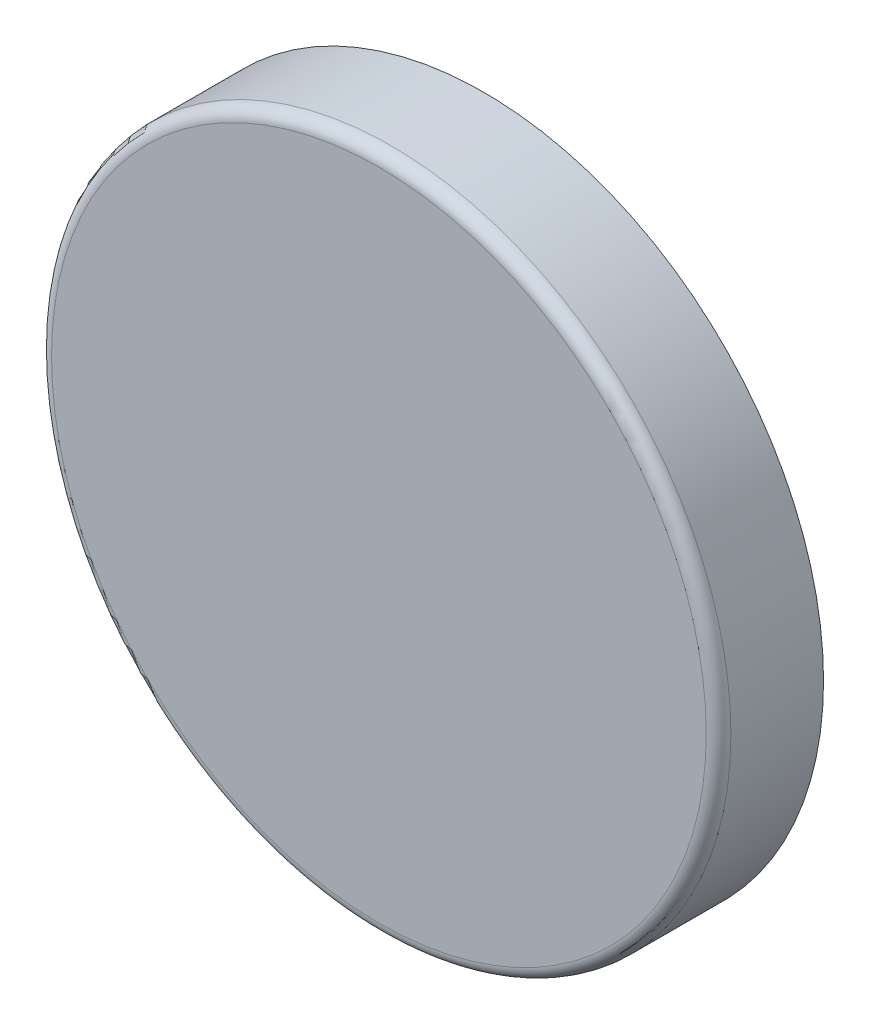
ISO-10303-21;
HEADER;
FILE_DESCRIPTION(('STEP AP214'),'2;1');
FILE_NAME('part.step','',(''),(''),'','','');
FILE_SCHEMA(('AUTOMOTIVE_DESIGN { 1 0 10303 214 1 1 1 1 }'));
ENDSEC;
DATA;
#1=APPLICATION_CONTEXT('core data for automotive mechanical design processes');
#2=APPLICATION_PROTOCOL_DEFINITION('international standard','automotive_design',2000,#1);
#3=PRODUCT_CONTEXT('',#1,'mechanical');
#4=PRODUCT('Part','Part','',(#3));
#5=PRODUCT_RELATED_PRODUCT_CATEGORY('part','',(#4));
#6=PRODUCT_DEFINITION_FORMATION('','',#4);
#7=PRODUCT_DEFINITION_CONTEXT('part definition',#1,'design');
#8=PRODUCT_DEFINITION('design','',#6,#7);
#9=PRODUCT_DEFINITION_SHAPE('','',#8);
#10=(LENGTH_UNIT() NAMED_UNIT(*) SI_UNIT(.MILLI.,.METRE.));
#11=(NAMED_UNIT(*) PLANE_ANGLE_UNIT() SI_UNIT($,.RADIAN.));
#12=(NAMED_UNIT(*) SI_UNIT($,.STERADIAN.) SOLID_ANGLE_UNIT());
#13=UNCERTAINTY_MEASURE_WITH_UNIT(LENGTH_MEASURE(1.E-05),#10,'distance_accuracy_value','');
#14=(GEOMETRIC_REPRESENTATION_CONTEXT(3) GLOBAL_UNCERTAINTY_ASSIGNED_CONTEXT((#13)) GLOBAL_UNIT_ASSIGNED_CONTEXT((#10,
#11,#12)) REPRESENTATION_CONTEXT('',''));
#15=CARTESIAN_POINT('',(0.,0.,0.));
#16=DIRECTION('',(0.,0.,1.));
#17=DIRECTION('',(1.,0.,0.));
#18=AXIS2_PLACEMENT_3D('',#15,#16,#17);
#19=CARTESIAN_POINT('',(907.549009259552,1390.8265693813,1329.0165382354));
#20=DIRECTION('',(0.,0.,-1.));
#21=DIRECTION('',(-1.,0.,0.));
#22=AXIS2_PLACEMENT_3D('',#19,#20,#21);
#23=CYLINDRICAL_SURFACE('',#22,54.999999999999);
#24=CARTESIAN_POINT('',(907.549009259552,1390.8265693813,1327.0165382354));
#25=DIRECTION('',(0.,0.,1.));
#26=DIRECTION('',(1.,0.,0.));
#27=AXIS2_PLACEMENT_3D('',#24,#25,#26);
#28=CIRCLE('',#27,54.999999999999);
#29=CARTESIAN_POINT('',(962.549009259551,1390.8265693813,1327.0165382354));
#30=VERTEX_POINT('',#29);
#31=EDGE_CURVE('E10',#30,#30,#28,.F.);
#32=ORIENTED_EDGE('',*,*,#31,.T.);
#33=EDGE_LOOP('',(#32));
#34=FACE_BOUND('',#33,.T.);
#35=CARTESIAN_POINT('',(907.549009259552,1390.8265693813,1312.0165382354));
#36=DIRECTION('',(0.,0.,1.));
#37=DIRECTION('',(1.,0.,0.));
#38=AXIS2_PLACEMENT_3D('',#35,#36,#37);
#39=CIRCLE('',#38,54.999999999999);
#40=CARTESIAN_POINT('',(962.549009259551,1390.8265693813,1312.0165382354));
#41=VERTEX_POINT('',#40);
#42=EDGE_CURVE('E54',#41,#41,#39,.T.);
#43=ORIENTED_EDGE('',*,*,#42,.T.);
#44=EDGE_LOOP('',(#43));
#45=FACE_BOUND('',#44,.T.);
#46=ADVANCED_FACE('F43',(#34,#45),#23,.T.);
#47=CARTESIAN_POINT('',(907.549009259552,1390.8265693813,1329.0165382354));
#48=DIRECTION('',(0.,0.,1.));
#49=DIRECTION('',(1.,0.,0.));
#50=AXIS2_PLACEMENT_3D('',#47,#48,#49);
#51=PLANE('',#50);
#52=CARTESIAN_POINT('',(907.549009259552,1390.8265693813,1329.0165382354));
#53=DIRECTION('',(0.,0.,1.));
#54=DIRECTION('',(1.,0.,0.));
#55=AXIS2_PLACEMENT_3D('',#52,#53,#54);
#56=CIRCLE('',#55,52.999999999999);
#57=CARTESIAN_POINT('',(960.549009259551,1390.8265693813,1329.0165382354));
#58=VERTEX_POINT('',#57);
#59=EDGE_CURVE('E50',#58,#58,#56,.T.);
#60=ORIENTED_EDGE('',*,*,#59,.T.);
#61=EDGE_LOOP('',(#60));
#62=FACE_BOUND('',#61,.T.);
#63=ADVANCED_FACE('F64',(#62),#51,.T.);
#64=CARTESIAN_POINT('',(907.549009259552,1390.8265693813,1312.0165382354));
#65=DIRECTION('',(0.,0.,1.));
#66=DIRECTION('',(1.,0.,0.));
#67=AXIS2_PLACEMENT_3D('',#64,#65,#66);
#68=PLANE('',#67);
#69=ORIENTED_EDGE('',*,*,#42,.F.);
#70=EDGE_LOOP('',(#69));
#71=FACE_BOUND('',#70,.T.);
#72=ADVANCED_FACE('F62',(#71),#68,.F.);
#73=CARTESIAN_POINT('',(907.549009259552,1390.8265693813,1327.0165382354));
#74=DIRECTION('',(0.,0.,1.));
#75=DIRECTION('',(1.,0.,0.));
#76=AXIS2_PLACEMENT_3D('',#73,#74,#75);
#77=TOROIDAL_SURFACE('',#76,52.999999999999,2.);
#78=ORIENTED_EDGE('',*,*,#31,.F.);
#79=EDGE_LOOP('',(#78));
#80=FACE_BOUND('',#79,.T.);
#81=ORIENTED_EDGE('',*,*,#59,.F.);
#82=EDGE_LOOP('',(#81));
#83=FACE_BOUND('',#82,.T.);
#84=ADVANCED_FACE('F45',(#80,#83),#77,.T.);
#85=CLOSED_SHELL('',(#46,#63,#72,#84));
#86=MANIFOLD_SOLID_BREP('B2',#85);
#87=ADVANCED_BREP_SHAPE_REPRESENTATION('',(#18,#86),#14);
#88=SHAPE_DEFINITION_REPRESENTATION(#9,#87);
ENDSEC;
END-ISO-10303-21;
